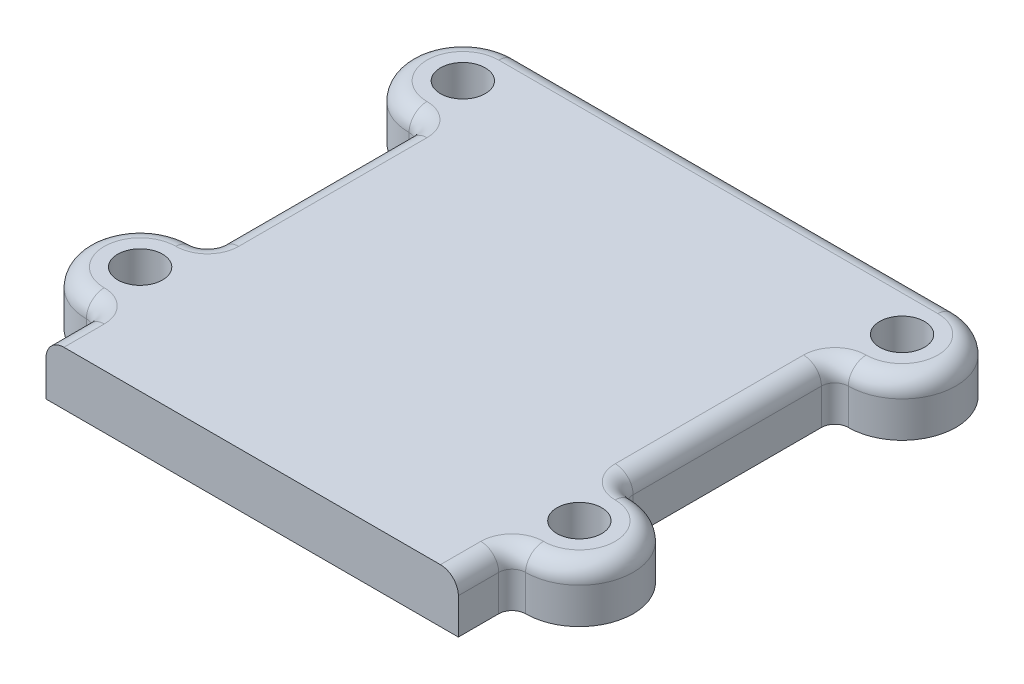
ISO-10303-21;
HEADER;
FILE_DESCRIPTION(('STEP AP214'),'2;1');
FILE_NAME('part.step','',(''),(''),'','','');
FILE_SCHEMA(('AUTOMOTIVE_DESIGN { 1 0 10303 214 1 1 1 1 }'));
ENDSEC;
DATA;
#1=APPLICATION_CONTEXT('core data for automotive mechanical design processes');
#2=APPLICATION_PROTOCOL_DEFINITION('international standard','automotive_design',2000,#1);
#3=PRODUCT_CONTEXT('',#1,'mechanical');
#4=PRODUCT('Part','Part','',(#3));
#5=PRODUCT_RELATED_PRODUCT_CATEGORY('part','',(#4));
#6=PRODUCT_DEFINITION_FORMATION('','',#4);
#7=PRODUCT_DEFINITION_CONTEXT('part definition',#1,'design');
#8=PRODUCT_DEFINITION('design','',#6,#7);
#9=PRODUCT_DEFINITION_SHAPE('','',#8);
#10=(LENGTH_UNIT() NAMED_UNIT(*) SI_UNIT(.MILLI.,.METRE.));
#11=(NAMED_UNIT(*) PLANE_ANGLE_UNIT() SI_UNIT($,.RADIAN.));
#12=(NAMED_UNIT(*) SI_UNIT($,.STERADIAN.) SOLID_ANGLE_UNIT());
#13=UNCERTAINTY_MEASURE_WITH_UNIT(LENGTH_MEASURE(1.E-05),#10,'distance_accuracy_value','');
#14=(GEOMETRIC_REPRESENTATION_CONTEXT(3) GLOBAL_UNCERTAINTY_ASSIGNED_CONTEXT((#13)) GLOBAL_UNIT_ASSIGNED_CONTEXT((#10,
#11,#12)) REPRESENTATION_CONTEXT('',''));
#15=CARTESIAN_POINT('',(0.,0.,0.));
#16=DIRECTION('',(0.,0.,1.));
#17=DIRECTION('',(1.,0.,0.));
#18=AXIS2_PLACEMENT_3D('',#15,#16,#17);
#19=CARTESIAN_POINT('',(12.25,3.,21.));
#20=DIRECTION('',(0.,-1.,0.));
#21=DIRECTION('',(0.,0.,-1.));
#22=AXIS2_PLACEMENT_3D('',#19,#20,#21);
#23=PLANE('',#22);
#24=DIRECTION('',(1.,0.,0.));
#25=VECTOR('',#24,1.);
#26=CARTESIAN_POINT('',(-11.5,3.,27.0000000000913));
#27=LINE('',#26,#25);
#28=CARTESIAN_POINT('',(-10.5,3.,27.0000000000913));
#29=VERTEX_POINT('',#28);
#30=CARTESIAN_POINT('',(10.5,3.,27.0000000000913));
#31=VERTEX_POINT('',#30);
#32=EDGE_CURVE('E234',#29,#31,#27,.T.);
#33=ORIENTED_EDGE('',*,*,#32,.T.);
#34=DIRECTION('',(0.,0.,-1.));
#35=VECTOR('',#34,1.);
#36=CARTESIAN_POINT('',(10.5,3.,21.));
#37=LINE('',#36,#35);
#38=CARTESIAN_POINT('',(10.5,3.,24.75));
#39=VERTEX_POINT('',#38);
#40=EDGE_CURVE('E329',#31,#39,#37,.T.);
#41=ORIENTED_EDGE('',*,*,#40,.T.);
#42=CARTESIAN_POINT('',(12.25,3.,24.75));
#43=DIRECTION('',(0.,-1.,0.));
#44=DIRECTION('',(0.,0.,-1.));
#45=AXIS2_PLACEMENT_3D('',#42,#43,#44);
#46=CIRCLE('',#45,1.75);
#47=CARTESIAN_POINT('',(12.25,3.,23.));
#48=VERTEX_POINT('',#47);
#49=EDGE_CURVE('E327',#39,#48,#46,.T.);
#50=ORIENTED_EDGE('',*,*,#49,.T.);
#51=CARTESIAN_POINT('',(12.25,3.,21.));
#52=DIRECTION('',(0.,-1.,0.));
#53=DIRECTION('',(0.,0.,-1.));
#54=AXIS2_PLACEMENT_3D('',#51,#52,#53);
#55=CIRCLE('',#54,2.);
#56=CARTESIAN_POINT('',(12.25,3.,19.));
#57=VERTEX_POINT('',#56);
#58=EDGE_CURVE('E325',#48,#57,#55,.F.);
#59=ORIENTED_EDGE('',*,*,#58,.T.);
#60=CARTESIAN_POINT('',(12.25,3.,17.25));
#61=DIRECTION('',(0.,-1.,0.));
#62=DIRECTION('',(0.,0.,-1.));
#63=AXIS2_PLACEMENT_3D('',#60,#61,#62);
#64=CIRCLE('',#63,1.75);
#65=CARTESIAN_POINT('',(10.5,3.,17.25));
#66=VERTEX_POINT('',#65);
#67=EDGE_CURVE('E323',#57,#66,#64,.T.);
#68=ORIENTED_EDGE('',*,*,#67,.T.);
#69=DIRECTION('',(0.,0.,-1.));
#70=VECTOR('',#69,1.);
#71=CARTESIAN_POINT('',(10.5,3.,21.));
#72=LINE('',#71,#70);
#73=CARTESIAN_POINT('',(10.5,3.,6.74999999999999));
#74=VERTEX_POINT('',#73);
#75=EDGE_CURVE('E301',#66,#74,#72,.T.);
#76=ORIENTED_EDGE('',*,*,#75,.T.);
#77=CARTESIAN_POINT('',(12.25,3.,6.74999999999999));
#78=DIRECTION('',(0.,-1.,0.));
#79=DIRECTION('',(0.,0.,-1.));
#80=AXIS2_PLACEMENT_3D('',#77,#78,#79);
#81=CIRCLE('',#80,1.75);
#82=CARTESIAN_POINT('',(12.25,3.,4.99999999999999));
#83=VERTEX_POINT('',#82);
#84=EDGE_CURVE('E303',#74,#83,#81,.T.);
#85=ORIENTED_EDGE('',*,*,#84,.T.);
#86=CARTESIAN_POINT('',(12.25,3.,2.99999999999999));
#87=DIRECTION('',(0.,-1.,0.));
#88=DIRECTION('',(0.,0.,-1.));
#89=AXIS2_PLACEMENT_3D('',#86,#87,#88);
#90=CIRCLE('',#89,2.);
#91=CARTESIAN_POINT('',(12.25,3.,0.999999999999996));
#92=VERTEX_POINT('',#91);
#93=EDGE_CURVE('E305',#83,#92,#90,.F.);
#94=ORIENTED_EDGE('',*,*,#93,.T.);
#95=DIRECTION('',(-1.,0.,0.));
#96=VECTOR('',#95,1.);
#97=CARTESIAN_POINT('',(12.25,3.,0.999999999999997));
#98=LINE('',#97,#96);
#99=CARTESIAN_POINT('',(-12.25,3.,1.));
#100=VERTEX_POINT('',#99);
#101=EDGE_CURVE('E307',#92,#100,#98,.T.);
#102=ORIENTED_EDGE('',*,*,#101,.T.);
#103=CARTESIAN_POINT('',(-12.25,3.,3.));
#104=DIRECTION('',(0.,-1.,0.));
#105=DIRECTION('',(0.,0.,-1.));
#106=AXIS2_PLACEMENT_3D('',#103,#104,#105);
#107=CIRCLE('',#106,2.);
#108=CARTESIAN_POINT('',(-12.25,3.,4.99999999999999));
#109=VERTEX_POINT('',#108);
#110=EDGE_CURVE('E309',#100,#109,#107,.F.);
#111=ORIENTED_EDGE('',*,*,#110,.T.);
#112=CARTESIAN_POINT('',(-12.25,3.,6.74999999999999));
#113=DIRECTION('',(0.,-1.,0.));
#114=DIRECTION('',(0.,0.,-1.));
#115=AXIS2_PLACEMENT_3D('',#112,#113,#114);
#116=CIRCLE('',#115,1.75);
#117=CARTESIAN_POINT('',(-10.5,3.,6.74999999999999));
#118=VERTEX_POINT('',#117);
#119=EDGE_CURVE('E311',#109,#118,#116,.T.);
#120=ORIENTED_EDGE('',*,*,#119,.T.);
#121=DIRECTION('',(0.,0.,1.));
#122=VECTOR('',#121,1.);
#123=CARTESIAN_POINT('',(-10.5,3.,21.));
#124=LINE('',#123,#122);
#125=CARTESIAN_POINT('',(-10.5,3.,17.25));
#126=VERTEX_POINT('',#125);
#127=EDGE_CURVE('E313',#118,#126,#124,.T.);
#128=ORIENTED_EDGE('',*,*,#127,.T.);
#129=CARTESIAN_POINT('',(-12.25,3.,17.25));
#130=DIRECTION('',(0.,-1.,0.));
#131=DIRECTION('',(0.,0.,-1.));
#132=AXIS2_PLACEMENT_3D('',#129,#130,#131);
#133=CIRCLE('',#132,1.75);
#134=CARTESIAN_POINT('',(-12.25,3.,19.));
#135=VERTEX_POINT('',#134);
#136=EDGE_CURVE('E315',#126,#135,#133,.T.);
#137=ORIENTED_EDGE('',*,*,#136,.T.);
#138=CARTESIAN_POINT('',(-12.25,3.,21.));
#139=DIRECTION('',(0.,-1.,0.));
#140=DIRECTION('',(0.,0.,-1.));
#141=AXIS2_PLACEMENT_3D('',#138,#139,#140);
#142=CIRCLE('',#141,2.);
#143=CARTESIAN_POINT('',(-12.25,3.,23.));
#144=VERTEX_POINT('',#143);
#145=EDGE_CURVE('E317',#135,#144,#142,.F.);
#146=ORIENTED_EDGE('',*,*,#145,.T.);
#147=CARTESIAN_POINT('',(-12.25,3.,24.75));
#148=DIRECTION('',(0.,-1.,0.));
#149=DIRECTION('',(0.,0.,-1.));
#150=AXIS2_PLACEMENT_3D('',#147,#148,#149);
#151=CIRCLE('',#150,1.75);
#152=CARTESIAN_POINT('',(-10.5,3.,24.75));
#153=VERTEX_POINT('',#152);
#154=EDGE_CURVE('E319',#144,#153,#151,.T.);
#155=ORIENTED_EDGE('',*,*,#154,.T.);
#156=DIRECTION('',(0.,0.,1.));
#157=VECTOR('',#156,1.);
#158=CARTESIAN_POINT('',(-10.5,3.,21.));
#159=LINE('',#158,#157);
#160=EDGE_CURVE('E321',#153,#29,#159,.T.);
#161=ORIENTED_EDGE('',*,*,#160,.T.);
#162=EDGE_LOOP('',(#33,#41,#50,#59,#68,#76,#85,#94,#102,#111,#120,#128,#137,#146,#155,#161));
#163=FACE_BOUND('',#162,.T.);
#164=CARTESIAN_POINT('',(12.25,3.,2.99999999999999));
#165=DIRECTION('',(0.,1.,0.));
#166=DIRECTION('',(0.,0.,1.));
#167=AXIS2_PLACEMENT_3D('',#164,#165,#166);
#168=CIRCLE('',#167,1.25);
#169=CARTESIAN_POINT('',(12.25,3.,4.25));
#170=VERTEX_POINT('',#169);
#171=EDGE_CURVE('E228',#170,#170,#168,.T.);
#172=ORIENTED_EDGE('',*,*,#171,.F.);
#173=EDGE_LOOP('',(#172));
#174=FACE_BOUND('',#173,.T.);
#175=CARTESIAN_POINT('',(12.25,3.,21.));
#176=DIRECTION('',(0.,1.,0.));
#177=DIRECTION('',(0.,0.,1.));
#178=AXIS2_PLACEMENT_3D('',#175,#176,#177);
#179=CIRCLE('',#178,1.25);
#180=CARTESIAN_POINT('',(12.25,3.,22.25));
#181=VERTEX_POINT('',#180);
#182=EDGE_CURVE('E422',#181,#181,#179,.T.);
#183=ORIENTED_EDGE('',*,*,#182,.F.);
#184=EDGE_LOOP('',(#183));
#185=FACE_BOUND('',#184,.T.);
#186=CARTESIAN_POINT('',(-12.25,3.,21.));
#187=DIRECTION('',(0.,1.,0.));
#188=DIRECTION('',(0.,0.,-1.));
#189=AXIS2_PLACEMENT_3D('',#186,#187,#188);
#190=CIRCLE('',#189,1.25);
#191=CARTESIAN_POINT('',(-12.25,3.,19.75));
#192=VERTEX_POINT('',#191);
#193=EDGE_CURVE('E416',#192,#192,#190,.T.);
#194=ORIENTED_EDGE('',*,*,#193,.F.);
#195=EDGE_LOOP('',(#194));
#196=FACE_BOUND('',#195,.T.);
#197=CARTESIAN_POINT('',(-12.25,3.,3.));
#198=DIRECTION('',(0.,1.,0.));
#199=DIRECTION('',(0.,0.,-1.));
#200=AXIS2_PLACEMENT_3D('',#197,#198,#199);
#201=CIRCLE('',#200,1.25);
#202=CARTESIAN_POINT('',(-12.25,3.,1.74999999999999));
#203=VERTEX_POINT('',#202);
#204=EDGE_CURVE('E408',#203,#203,#201,.T.);
#205=ORIENTED_EDGE('',*,*,#204,.F.);
#206=EDGE_LOOP('',(#205));
#207=FACE_BOUND('',#206,.T.);
#208=ADVANCED_FACE('F36',(#163,#174,#185,#196,#207),#23,.F.);
#209=CARTESIAN_POINT('',(12.25,0.,21.));
#210=DIRECTION('',(0.,-1.,0.));
#211=DIRECTION('',(0.,0.,-1.));
#212=AXIS2_PLACEMENT_3D('',#209,#210,#211);
#213=PLANE('',#212);
#214=CARTESIAN_POINT('',(-12.25,0.,21.));
#215=DIRECTION('',(0.,1.,0.));
#216=DIRECTION('',(0.,0.,-1.));
#217=AXIS2_PLACEMENT_3D('',#214,#215,#216);
#218=CIRCLE('',#217,1.25);
#219=CARTESIAN_POINT('',(-12.25,0.,19.75));
#220=VERTEX_POINT('',#219);
#221=EDGE_CURVE('E413',#220,#220,#218,.T.);
#222=ORIENTED_EDGE('',*,*,#221,.T.);
#223=EDGE_LOOP('',(#222));
#224=FACE_BOUND('',#223,.T.);
#225=CARTESIAN_POINT('',(12.25,0.,2.99999999999999));
#226=DIRECTION('',(0.,1.,0.));
#227=DIRECTION('',(0.,0.,1.));
#228=AXIS2_PLACEMENT_3D('',#225,#226,#227);
#229=CIRCLE('',#228,1.25);
#230=CARTESIAN_POINT('',(12.25,0.,4.25));
#231=VERTEX_POINT('',#230);
#232=EDGE_CURVE('E231',#231,#231,#229,.T.);
#233=ORIENTED_EDGE('',*,*,#232,.T.);
#234=EDGE_LOOP('',(#233));
#235=FACE_BOUND('',#234,.T.);
#236=DIRECTION('',(1.,0.,0.));
#237=VECTOR('',#236,1.);
#238=CARTESIAN_POINT('',(-11.5,0.,27.0000000000913));
#239=LINE('',#238,#237);
#240=CARTESIAN_POINT('',(-11.5,0.,27.0000000000913));
#241=VERTEX_POINT('',#240);
#242=CARTESIAN_POINT('',(11.5,0.,27.0000000000913));
#243=VERTEX_POINT('',#242);
#244=EDGE_CURVE('E218',#241,#243,#239,.T.);
#245=ORIENTED_EDGE('',*,*,#244,.F.);
#246=DIRECTION('',(0.,0.,1.));
#247=VECTOR('',#246,1.);
#248=CARTESIAN_POINT('',(-11.5,0.,24.));
#249=LINE('',#248,#247);
#250=CARTESIAN_POINT('',(-11.5,0.,24.75));
#251=VERTEX_POINT('',#250);
#252=EDGE_CURVE('E257',#251,#241,#249,.T.);
#253=ORIENTED_EDGE('',*,*,#252,.F.);
#254=CARTESIAN_POINT('',(-12.25,0.,24.75));
#255=DIRECTION('',(0.,-1.,0.));
#256=DIRECTION('',(0.,0.,-1.));
#257=AXIS2_PLACEMENT_3D('',#254,#255,#256);
#258=CIRCLE('',#257,0.75);
#259=CARTESIAN_POINT('',(-12.25,0.,24.));
#260=VERTEX_POINT('',#259);
#261=EDGE_CURVE('E289',#251,#260,#258,.F.);
#262=ORIENTED_EDGE('',*,*,#261,.T.);
#263=CARTESIAN_POINT('',(-12.25,0.,21.));
#264=DIRECTION('',(0.,1.,0.));
#265=DIRECTION('',(0.,0.,1.));
#266=AXIS2_PLACEMENT_3D('',#263,#264,#265);
#267=CIRCLE('',#266,3.);
#268=CARTESIAN_POINT('',(-12.25,0.,18.));
#269=VERTEX_POINT('',#268);
#270=EDGE_CURVE('E254',#269,#260,#267,.T.);
#271=ORIENTED_EDGE('',*,*,#270,.F.);
#272=CARTESIAN_POINT('',(-12.25,0.,17.25));
#273=DIRECTION('',(0.,-1.,0.));
#274=DIRECTION('',(0.,0.,-1.));
#275=AXIS2_PLACEMENT_3D('',#272,#273,#274);
#276=CIRCLE('',#275,0.75);
#277=CARTESIAN_POINT('',(-11.5,0.,17.25));
#278=VERTEX_POINT('',#277);
#279=EDGE_CURVE('E287',#269,#278,#276,.F.);
#280=ORIENTED_EDGE('',*,*,#279,.T.);
#281=DIRECTION('',(0.,0.,1.));
#282=VECTOR('',#281,1.);
#283=CARTESIAN_POINT('',(-11.5,0.,5.99999999999999));
#284=LINE('',#283,#282);
#285=CARTESIAN_POINT('',(-11.5,0.,6.74999999999999));
#286=VERTEX_POINT('',#285);
#287=EDGE_CURVE('E251',#286,#278,#284,.T.);
#288=ORIENTED_EDGE('',*,*,#287,.F.);
#289=CARTESIAN_POINT('',(-12.25,0.,6.74999999999999));
#290=DIRECTION('',(0.,-1.,0.));
#291=DIRECTION('',(0.,0.,-1.));
#292=AXIS2_PLACEMENT_3D('',#289,#290,#291);
#293=CIRCLE('',#292,0.75);
#294=CARTESIAN_POINT('',(-12.25,0.,5.99999999999999));
#295=VERTEX_POINT('',#294);
#296=EDGE_CURVE('E292',#286,#295,#293,.F.);
#297=ORIENTED_EDGE('',*,*,#296,.T.);
#298=CARTESIAN_POINT('',(-12.25,0.,3.));
#299=DIRECTION('',(0.,1.,0.));
#300=DIRECTION('',(0.,0.,1.));
#301=AXIS2_PLACEMENT_3D('',#298,#299,#300);
#302=CIRCLE('',#301,3.);
#303=CARTESIAN_POINT('',(-12.25,0.,0.));
#304=VERTEX_POINT('',#303);
#305=EDGE_CURVE('E248',#304,#295,#302,.T.);
#306=ORIENTED_EDGE('',*,*,#305,.F.);
#307=DIRECTION('',(-1.,0.,0.));
#308=VECTOR('',#307,1.);
#309=CARTESIAN_POINT('',(-12.25,0.,0.));
#310=LINE('',#309,#308);
#311=CARTESIAN_POINT('',(12.25,0.,0.));
#312=VERTEX_POINT('',#311);
#313=EDGE_CURVE('E245',#312,#304,#310,.T.);
#314=ORIENTED_EDGE('',*,*,#313,.F.);
#315=CARTESIAN_POINT('',(12.25,0.,2.99999999999999));
#316=DIRECTION('',(0.,1.,0.));
#317=DIRECTION('',(0.,0.,-1.));
#318=AXIS2_PLACEMENT_3D('',#315,#316,#317);
#319=CIRCLE('',#318,3.);
#320=CARTESIAN_POINT('',(12.25,0.,5.99999999999999));
#321=VERTEX_POINT('',#320);
#322=EDGE_CURVE('E242',#321,#312,#319,.T.);
#323=ORIENTED_EDGE('',*,*,#322,.F.);
#324=CARTESIAN_POINT('',(12.25,0.,6.74999999999999));
#325=DIRECTION('',(0.,-1.,0.));
#326=DIRECTION('',(0.,0.,-1.));
#327=AXIS2_PLACEMENT_3D('',#324,#325,#326);
#328=CIRCLE('',#327,0.75);
#329=CARTESIAN_POINT('',(11.5,0.,6.74999999999999));
#330=VERTEX_POINT('',#329);
#331=EDGE_CURVE('E295',#321,#330,#328,.F.);
#332=ORIENTED_EDGE('',*,*,#331,.T.);
#333=DIRECTION('',(0.,0.,-1.));
#334=VECTOR('',#333,1.);
#335=CARTESIAN_POINT('',(11.5,0.,5.99999999999999));
#336=LINE('',#335,#334);
#337=CARTESIAN_POINT('',(11.5,0.,17.25));
#338=VERTEX_POINT('',#337);
#339=EDGE_CURVE('E239',#338,#330,#336,.T.);
#340=ORIENTED_EDGE('',*,*,#339,.F.);
#341=CARTESIAN_POINT('',(12.25,0.,17.25));
#342=DIRECTION('',(0.,-1.,0.));
#343=DIRECTION('',(0.,0.,-1.));
#344=AXIS2_PLACEMENT_3D('',#341,#342,#343);
#345=CIRCLE('',#344,0.75);
#346=CARTESIAN_POINT('',(12.25,0.,18.));
#347=VERTEX_POINT('',#346);
#348=EDGE_CURVE('E298',#338,#347,#345,.F.);
#349=ORIENTED_EDGE('',*,*,#348,.T.);
#350=CARTESIAN_POINT('',(12.25,0.,21.));
#351=DIRECTION('',(0.,1.,0.));
#352=DIRECTION('',(0.,0.,-1.));
#353=AXIS2_PLACEMENT_3D('',#350,#351,#352);
#354=CIRCLE('',#353,3.);
#355=CARTESIAN_POINT('',(12.25,0.,24.));
#356=VERTEX_POINT('',#355);
#357=EDGE_CURVE('E222',#356,#347,#354,.T.);
#358=ORIENTED_EDGE('',*,*,#357,.F.);
#359=CARTESIAN_POINT('',(12.25,0.,24.75));
#360=DIRECTION('',(0.,-1.,0.));
#361=DIRECTION('',(0.,0.,-1.));
#362=AXIS2_PLACEMENT_3D('',#359,#360,#361);
#363=CIRCLE('',#362,0.75);
#364=CARTESIAN_POINT('',(11.5,0.,24.75));
#365=VERTEX_POINT('',#364);
#366=EDGE_CURVE('E221',#356,#365,#363,.F.);
#367=ORIENTED_EDGE('',*,*,#366,.T.);
#368=DIRECTION('',(0.,0.,-1.));
#369=VECTOR('',#368,1.);
#370=CARTESIAN_POINT('',(11.5,0.,24.));
#371=LINE('',#370,#369);
#372=EDGE_CURVE('E203',#243,#365,#371,.T.);
#373=ORIENTED_EDGE('',*,*,#372,.F.);
#374=EDGE_LOOP('',(#245,#253,#262,#271,#280,#288,#297,#306,#314,#323,#332,#340,#349,#358,#367,#373));
#375=FACE_BOUND('',#374,.T.);
#376=CARTESIAN_POINT('',(12.25,0.,21.));
#377=DIRECTION('',(0.,1.,0.));
#378=DIRECTION('',(0.,0.,1.));
#379=AXIS2_PLACEMENT_3D('',#376,#377,#378);
#380=CIRCLE('',#379,1.25);
#381=CARTESIAN_POINT('',(12.25,0.,22.25));
#382=VERTEX_POINT('',#381);
#383=EDGE_CURVE('E419',#382,#382,#380,.T.);
#384=ORIENTED_EDGE('',*,*,#383,.T.);
#385=EDGE_LOOP('',(#384));
#386=FACE_BOUND('',#385,.T.);
#387=CARTESIAN_POINT('',(-12.25,0.,3.));
#388=DIRECTION('',(0.,1.,0.));
#389=DIRECTION('',(0.,0.,-1.));
#390=AXIS2_PLACEMENT_3D('',#387,#388,#389);
#391=CIRCLE('',#390,1.25);
#392=CARTESIAN_POINT('',(-12.25,0.,1.74999999999999));
#393=VERTEX_POINT('',#392);
#394=EDGE_CURVE('E402',#393,#393,#391,.T.);
#395=ORIENTED_EDGE('',*,*,#394,.T.);
#396=EDGE_LOOP('',(#395));
#397=FACE_BOUND('',#396,.T.);
#398=ADVANCED_FACE('F215',(#224,#235,#375,#386,#397),#213,.T.);
#399=CARTESIAN_POINT('',(-11.5,3.,27.0000000000913));
#400=DIRECTION('',(0.,0.,-1.));
#401=DIRECTION('',(-1.,0.,0.));
#402=AXIS2_PLACEMENT_3D('',#399,#400,#401);
#403=PLANE('',#402);
#404=DIRECTION('',(0.,-1.,0.));
#405=VECTOR('',#404,1.);
#406=CARTESIAN_POINT('',(11.5,3.,27.0000000000913));
#407=LINE('',#406,#405);
#408=CARTESIAN_POINT('',(11.5,2.,27.0000000000913));
#409=VERTEX_POINT('',#408);
#410=EDGE_CURVE('E199',#409,#243,#407,.T.);
#411=ORIENTED_EDGE('',*,*,#410,.F.);
#412=CARTESIAN_POINT('',(10.5,2.,27.0000000000913));
#413=DIRECTION('',(0.,0.,-1.));
#414=DIRECTION('',(-1.,0.,0.));
#415=AXIS2_PLACEMENT_3D('',#412,#413,#414);
#416=CIRCLE('',#415,1.);
#417=EDGE_CURVE('E335',#409,#31,#416,.F.);
#418=ORIENTED_EDGE('',*,*,#417,.T.);
#419=ORIENTED_EDGE('',*,*,#32,.F.);
#420=CARTESIAN_POINT('',(-10.5,2.,27.0000000000913));
#421=DIRECTION('',(0.,0.,-1.));
#422=DIRECTION('',(-1.,0.,0.));
#423=AXIS2_PLACEMENT_3D('',#420,#421,#422);
#424=CIRCLE('',#423,1.);
#425=CARTESIAN_POINT('',(-11.5,2.,27.0000000000913));
#426=VERTEX_POINT('',#425);
#427=EDGE_CURVE('E333',#29,#426,#424,.F.);
#428=ORIENTED_EDGE('',*,*,#427,.T.);
#429=DIRECTION('',(0.,-1.,0.));
#430=VECTOR('',#429,1.);
#431=CARTESIAN_POINT('',(-11.5,3.,27.0000000000913));
#432=LINE('',#431,#430);
#433=EDGE_CURVE('E226',#426,#241,#432,.T.);
#434=ORIENTED_EDGE('',*,*,#433,.T.);
#435=ORIENTED_EDGE('',*,*,#244,.T.);
#436=EDGE_LOOP('',(#411,#418,#419,#428,#434,#435));
#437=FACE_BOUND('',#436,.T.);
#438=ADVANCED_FACE('F224',(#437),#403,.F.);
#439=CARTESIAN_POINT('',(11.5,3.,24.));
#440=DIRECTION('',(-1.,0.,0.));
#441=DIRECTION('',(0.,0.,1.));
#442=AXIS2_PLACEMENT_3D('',#439,#440,#441);
#443=PLANE('',#442);
#444=DIRECTION('',(0.,-1.,0.));
#445=VECTOR('',#444,1.);
#446=CARTESIAN_POINT('',(11.5,3.,24.75));
#447=LINE('',#446,#445);
#448=CARTESIAN_POINT('',(11.5,2.,24.75));
#449=VERTEX_POINT('',#448);
#450=EDGE_CURVE('E285',#365,#449,#447,.F.);
#451=ORIENTED_EDGE('',*,*,#450,.T.);
#452=DIRECTION('',(0.,0.,-1.));
#453=VECTOR('',#452,1.);
#454=CARTESIAN_POINT('',(11.5,2.,24.));
#455=LINE('',#454,#453);
#456=EDGE_CURVE('E206',#449,#409,#455,.F.);
#457=ORIENTED_EDGE('',*,*,#456,.T.);
#458=ORIENTED_EDGE('',*,*,#410,.T.);
#459=ORIENTED_EDGE('',*,*,#372,.T.);
#460=EDGE_LOOP('',(#451,#457,#458,#459));
#461=FACE_BOUND('',#460,.T.);
#462=ADVANCED_FACE('F202',(#461),#443,.F.);
#463=CARTESIAN_POINT('',(12.25,3.,21.));
#464=DIRECTION('',(0.,-1.,0.));
#465=DIRECTION('',(0.,0.,-1.));
#466=AXIS2_PLACEMENT_3D('',#463,#464,#465);
#467=CYLINDRICAL_SURFACE('',#466,3.);
#468=DIRECTION('',(0.,-1.,0.));
#469=VECTOR('',#468,1.);
#470=CARTESIAN_POINT('',(12.25,3.,18.));
#471=LINE('',#470,#469);
#472=CARTESIAN_POINT('',(12.25,2.,18.));
#473=VERTEX_POINT('',#472);
#474=EDGE_CURVE('E272',#473,#347,#471,.T.);
#475=ORIENTED_EDGE('',*,*,#474,.F.);
#476=CARTESIAN_POINT('',(12.25,2.,21.));
#477=DIRECTION('',(0.,-1.,0.));
#478=DIRECTION('',(0.,0.,-1.));
#479=AXIS2_PLACEMENT_3D('',#476,#477,#478);
#480=CIRCLE('',#479,3.);
#481=CARTESIAN_POINT('',(12.25,2.,24.));
#482=VERTEX_POINT('',#481);
#483=EDGE_CURVE('E339',#473,#482,#480,.T.);
#484=ORIENTED_EDGE('',*,*,#483,.T.);
#485=DIRECTION('',(0.,-1.,0.));
#486=VECTOR('',#485,1.);
#487=CARTESIAN_POINT('',(12.25,3.,24.));
#488=LINE('',#487,#486);
#489=EDGE_CURVE('E211',#482,#356,#488,.T.);
#490=ORIENTED_EDGE('',*,*,#489,.T.);
#491=ORIENTED_EDGE('',*,*,#357,.T.);
#492=EDGE_LOOP('',(#475,#484,#490,#491));
#493=FACE_BOUND('',#492,.T.);
#494=ADVANCED_FACE('F478',(#493),#467,.T.);
#495=CARTESIAN_POINT('',(11.5,3.,5.99999999999999));
#496=DIRECTION('',(-1.,0.,0.));
#497=DIRECTION('',(0.,0.,1.));
#498=AXIS2_PLACEMENT_3D('',#495,#496,#497);
#499=PLANE('',#498);
#500=DIRECTION('',(0.,-1.,0.));
#501=VECTOR('',#500,1.);
#502=CARTESIAN_POINT('',(11.5,3.,6.74999999999999));
#503=LINE('',#502,#501);
#504=CARTESIAN_POINT('',(11.5,2.,6.74999999999999));
#505=VERTEX_POINT('',#504);
#506=EDGE_CURVE('E283',#330,#505,#503,.F.);
#507=ORIENTED_EDGE('',*,*,#506,.T.);
#508=DIRECTION('',(0.,0.,-1.));
#509=VECTOR('',#508,1.);
#510=CARTESIAN_POINT('',(11.5,2.,5.99999999999999));
#511=LINE('',#510,#509);
#512=CARTESIAN_POINT('',(11.5,2.,17.25));
#513=VERTEX_POINT('',#512);
#514=EDGE_CURVE('E11',#505,#513,#511,.F.);
#515=ORIENTED_EDGE('',*,*,#514,.T.);
#516=DIRECTION('',(0.,-1.,0.));
#517=VECTOR('',#516,1.);
#518=CARTESIAN_POINT('',(11.5,0.,17.25));
#519=LINE('',#518,#517);
#520=EDGE_CURVE('E281',#513,#338,#519,.T.);
#521=ORIENTED_EDGE('',*,*,#520,.T.);
#522=ORIENTED_EDGE('',*,*,#339,.T.);
#523=EDGE_LOOP('',(#507,#515,#521,#522));
#524=FACE_BOUND('',#523,.T.);
#525=ADVANCED_FACE('F475',(#524),#499,.F.);
#526=CARTESIAN_POINT('',(12.25,3.,2.99999999999999));
#527=DIRECTION('',(0.,-1.,0.));
#528=DIRECTION('',(0.,0.,-1.));
#529=AXIS2_PLACEMENT_3D('',#526,#527,#528);
#530=CYLINDRICAL_SURFACE('',#529,3.);
#531=DIRECTION('',(0.,-1.,0.));
#532=VECTOR('',#531,1.);
#533=CARTESIAN_POINT('',(12.25,3.,0.));
#534=LINE('',#533,#532);
#535=CARTESIAN_POINT('',(12.25,2.,0.));
#536=VERTEX_POINT('',#535);
#537=EDGE_CURVE('E268',#536,#312,#534,.T.);
#538=ORIENTED_EDGE('',*,*,#537,.F.);
#539=CARTESIAN_POINT('',(12.25,2.,2.99999999999999));
#540=DIRECTION('',(0.,-1.,0.));
#541=DIRECTION('',(0.,0.,-1.));
#542=AXIS2_PLACEMENT_3D('',#539,#540,#541);
#543=CIRCLE('',#542,3.);
#544=CARTESIAN_POINT('',(12.25,2.,5.99999999999999));
#545=VERTEX_POINT('',#544);
#546=EDGE_CURVE('E60',#536,#545,#543,.T.);
#547=ORIENTED_EDGE('',*,*,#546,.T.);
#548=DIRECTION('',(0.,-1.,0.));
#549=VECTOR('',#548,1.);
#550=CARTESIAN_POINT('',(12.25,3.,5.99999999999999));
#551=LINE('',#550,#549);
#552=EDGE_CURVE('E270',#545,#321,#551,.T.);
#553=ORIENTED_EDGE('',*,*,#552,.T.);
#554=ORIENTED_EDGE('',*,*,#322,.T.);
#555=EDGE_LOOP('',(#538,#547,#553,#554));
#556=FACE_BOUND('',#555,.T.);
#557=ADVANCED_FACE('F471',(#556),#530,.T.);
#558=CARTESIAN_POINT('',(-12.25,3.,0.));
#559=DIRECTION('',(0.,0.,1.));
#560=DIRECTION('',(1.,0.,0.));
#561=AXIS2_PLACEMENT_3D('',#558,#559,#560);
#562=PLANE('',#561);
#563=DIRECTION('',(0.,-1.,0.));
#564=VECTOR('',#563,1.);
#565=CARTESIAN_POINT('',(-12.25,3.,0.));
#566=LINE('',#565,#564);
#567=CARTESIAN_POINT('',(-12.25,2.,0.));
#568=VERTEX_POINT('',#567);
#569=EDGE_CURVE('E266',#568,#304,#566,.T.);
#570=ORIENTED_EDGE('',*,*,#569,.F.);
#571=DIRECTION('',(-1.,0.,0.));
#572=VECTOR('',#571,1.);
#573=CARTESIAN_POINT('',(-12.25,2.,0.));
#574=LINE('',#573,#572);
#575=EDGE_CURVE('E357',#568,#536,#574,.F.);
#576=ORIENTED_EDGE('',*,*,#575,.T.);
#577=ORIENTED_EDGE('',*,*,#537,.T.);
#578=ORIENTED_EDGE('',*,*,#313,.T.);
#579=EDGE_LOOP('',(#570,#576,#577,#578));
#580=FACE_BOUND('',#579,.T.);
#581=ADVANCED_FACE('F467',(#580),#562,.F.);
#582=CARTESIAN_POINT('',(-12.25,3.,3.));
#583=DIRECTION('',(0.,-1.,0.));
#584=DIRECTION('',(0.,0.,-1.));
#585=AXIS2_PLACEMENT_3D('',#582,#583,#584);
#586=CYLINDRICAL_SURFACE('',#585,3.);
#587=DIRECTION('',(0.,-1.,0.));
#588=VECTOR('',#587,1.);
#589=CARTESIAN_POINT('',(-12.25,3.,5.99999999999999));
#590=LINE('',#589,#588);
#591=CARTESIAN_POINT('',(-12.25,2.,5.99999999999999));
#592=VERTEX_POINT('',#591);
#593=EDGE_CURVE('E264',#592,#295,#590,.T.);
#594=ORIENTED_EDGE('',*,*,#593,.F.);
#595=CARTESIAN_POINT('',(-12.25,2.,3.));
#596=DIRECTION('',(0.,-1.,0.));
#597=DIRECTION('',(0.,0.,-1.));
#598=AXIS2_PLACEMENT_3D('',#595,#596,#597);
#599=CIRCLE('',#598,3.);
#600=EDGE_CURVE('E355',#592,#568,#599,.T.);
#601=ORIENTED_EDGE('',*,*,#600,.T.);
#602=ORIENTED_EDGE('',*,*,#569,.T.);
#603=ORIENTED_EDGE('',*,*,#305,.T.);
#604=EDGE_LOOP('',(#594,#601,#602,#603));
#605=FACE_BOUND('',#604,.T.);
#606=ADVANCED_FACE('F463',(#605),#586,.T.);
#607=CARTESIAN_POINT('',(-11.5,3.,5.99999999999999));
#608=DIRECTION('',(1.,0.,0.));
#609=DIRECTION('',(0.,0.,-1.));
#610=AXIS2_PLACEMENT_3D('',#607,#608,#609);
#611=PLANE('',#610);
#612=DIRECTION('',(0.,-1.,0.));
#613=VECTOR('',#612,1.);
#614=CARTESIAN_POINT('',(-11.5,3.,17.25));
#615=LINE('',#614,#613);
#616=CARTESIAN_POINT('',(-11.5,2.,17.25));
#617=VERTEX_POINT('',#616);
#618=EDGE_CURVE('E276',#278,#617,#615,.F.);
#619=ORIENTED_EDGE('',*,*,#618,.T.);
#620=DIRECTION('',(0.,0.,1.));
#621=VECTOR('',#620,1.);
#622=CARTESIAN_POINT('',(-11.5,2.,5.99999999999999));
#623=LINE('',#622,#621);
#624=CARTESIAN_POINT('',(-11.5,2.,6.74999999999999));
#625=VERTEX_POINT('',#624);
#626=EDGE_CURVE('E351',#617,#625,#623,.F.);
#627=ORIENTED_EDGE('',*,*,#626,.T.);
#628=DIRECTION('',(0.,-1.,0.));
#629=VECTOR('',#628,1.);
#630=CARTESIAN_POINT('',(-11.5,0.,6.74999999999999));
#631=LINE('',#630,#629);
#632=EDGE_CURVE('E210',#625,#286,#631,.T.);
#633=ORIENTED_EDGE('',*,*,#632,.T.);
#634=ORIENTED_EDGE('',*,*,#287,.T.);
#635=EDGE_LOOP('',(#619,#627,#633,#634));
#636=FACE_BOUND('',#635,.T.);
#637=ADVANCED_FACE('F459',(#636),#611,.F.);
#638=CARTESIAN_POINT('',(-12.25,3.,21.));
#639=DIRECTION('',(0.,-1.,0.));
#640=DIRECTION('',(0.,0.,-1.));
#641=AXIS2_PLACEMENT_3D('',#638,#639,#640);
#642=CYLINDRICAL_SURFACE('',#641,3.);
#643=DIRECTION('',(0.,-1.,0.));
#644=VECTOR('',#643,1.);
#645=CARTESIAN_POINT('',(-12.25,3.,24.));
#646=LINE('',#645,#644);
#647=CARTESIAN_POINT('',(-12.25,2.,24.));
#648=VERTEX_POINT('',#647);
#649=EDGE_CURVE('E260',#648,#260,#646,.T.);
#650=ORIENTED_EDGE('',*,*,#649,.F.);
#651=CARTESIAN_POINT('',(-12.25,2.,21.));
#652=DIRECTION('',(0.,-1.,0.));
#653=DIRECTION('',(0.,0.,-1.));
#654=AXIS2_PLACEMENT_3D('',#651,#652,#653);
#655=CIRCLE('',#654,3.);
#656=CARTESIAN_POINT('',(-12.25,2.,18.));
#657=VERTEX_POINT('',#656);
#658=EDGE_CURVE('E347',#648,#657,#655,.T.);
#659=ORIENTED_EDGE('',*,*,#658,.T.);
#660=DIRECTION('',(0.,-1.,0.));
#661=VECTOR('',#660,1.);
#662=CARTESIAN_POINT('',(-12.25,3.,18.));
#663=LINE('',#662,#661);
#664=EDGE_CURVE('E262',#657,#269,#663,.T.);
#665=ORIENTED_EDGE('',*,*,#664,.T.);
#666=ORIENTED_EDGE('',*,*,#270,.T.);
#667=EDGE_LOOP('',(#650,#659,#665,#666));
#668=FACE_BOUND('',#667,.T.);
#669=ADVANCED_FACE('F443',(#668),#642,.T.);
#670=CARTESIAN_POINT('',(-11.5,3.,24.));
#671=DIRECTION('',(1.,0.,0.));
#672=DIRECTION('',(0.,0.,-1.));
#673=AXIS2_PLACEMENT_3D('',#670,#671,#672);
#674=PLANE('',#673);
#675=ORIENTED_EDGE('',*,*,#433,.F.);
#676=DIRECTION('',(0.,0.,1.));
#677=VECTOR('',#676,1.);
#678=CARTESIAN_POINT('',(-11.5,2.,24.));
#679=LINE('',#678,#677);
#680=CARTESIAN_POINT('',(-11.5,2.,24.75));
#681=VERTEX_POINT('',#680);
#682=EDGE_CURVE('E343',#426,#681,#679,.F.);
#683=ORIENTED_EDGE('',*,*,#682,.T.);
#684=DIRECTION('',(0.,-1.,0.));
#685=VECTOR('',#684,1.);
#686=CARTESIAN_POINT('',(-11.5,0.,24.75));
#687=LINE('',#686,#685);
#688=EDGE_CURVE('E279',#681,#251,#687,.T.);
#689=ORIENTED_EDGE('',*,*,#688,.T.);
#690=ORIENTED_EDGE('',*,*,#252,.T.);
#691=EDGE_LOOP('',(#675,#683,#689,#690));
#692=FACE_BOUND('',#691,.T.);
#693=ADVANCED_FACE('F433',(#692),#674,.F.);
#694=CARTESIAN_POINT('',(12.25,3.,2.99999999999999));
#695=DIRECTION('',(0.,-1.,0.));
#696=DIRECTION('',(0.,0.,-1.));
#697=AXIS2_PLACEMENT_3D('',#694,#695,#696);
#698=CYLINDRICAL_SURFACE('',#697,1.25);
#699=ORIENTED_EDGE('',*,*,#171,.T.);
#700=EDGE_LOOP('',(#699));
#701=FACE_BOUND('',#700,.T.);
#702=ORIENTED_EDGE('',*,*,#232,.F.);
#703=EDGE_LOOP('',(#702));
#704=FACE_BOUND('',#703,.T.);
#705=ADVANCED_FACE('F430',(#701,#704),#698,.F.);
#706=CARTESIAN_POINT('',(12.25,3.,21.));
#707=DIRECTION('',(0.,-1.,0.));
#708=DIRECTION('',(0.,0.,-1.));
#709=AXIS2_PLACEMENT_3D('',#706,#707,#708);
#710=CYLINDRICAL_SURFACE('',#709,1.25);
#711=ORIENTED_EDGE('',*,*,#182,.T.);
#712=EDGE_LOOP('',(#711));
#713=FACE_BOUND('',#712,.T.);
#714=ORIENTED_EDGE('',*,*,#383,.F.);
#715=EDGE_LOOP('',(#714));
#716=FACE_BOUND('',#715,.T.);
#717=ADVANCED_FACE('F432',(#713,#716),#710,.F.);
#718=CARTESIAN_POINT('',(-12.25,3.,21.));
#719=DIRECTION('',(0.,-1.,0.));
#720=DIRECTION('',(0.,0.,-1.));
#721=AXIS2_PLACEMENT_3D('',#718,#719,#720);
#722=CYLINDRICAL_SURFACE('',#721,1.25);
#723=ORIENTED_EDGE('',*,*,#193,.T.);
#724=EDGE_LOOP('',(#723));
#725=FACE_BOUND('',#724,.T.);
#726=ORIENTED_EDGE('',*,*,#221,.F.);
#727=EDGE_LOOP('',(#726));
#728=FACE_BOUND('',#727,.T.);
#729=ADVANCED_FACE('F440',(#725,#728),#722,.F.);
#730=CARTESIAN_POINT('',(-12.25,3.,3.));
#731=DIRECTION('',(0.,-1.,0.));
#732=DIRECTION('',(0.,0.,-1.));
#733=AXIS2_PLACEMENT_3D('',#730,#731,#732);
#734=CYLINDRICAL_SURFACE('',#733,1.25);
#735=ORIENTED_EDGE('',*,*,#204,.T.);
#736=EDGE_LOOP('',(#735));
#737=FACE_BOUND('',#736,.T.);
#738=ORIENTED_EDGE('',*,*,#394,.F.);
#739=EDGE_LOOP('',(#738));
#740=FACE_BOUND('',#739,.T.);
#741=ADVANCED_FACE('F491',(#737,#740),#734,.F.);
#742=CARTESIAN_POINT('',(-12.25,3.,17.25));
#743=DIRECTION('',(0.,1.,0.));
#744=DIRECTION('',(0.,0.,1.));
#745=AXIS2_PLACEMENT_3D('',#742,#743,#744);
#746=CYLINDRICAL_SURFACE('',#745,0.75);
#747=ORIENTED_EDGE('',*,*,#664,.F.);
#748=CARTESIAN_POINT('',(-12.25,2.,17.25));
#749=DIRECTION('',(0.,-1.,0.));
#750=DIRECTION('',(0.,0.,-1.));
#751=AXIS2_PLACEMENT_3D('',#748,#749,#750);
#752=CIRCLE('',#751,0.75);
#753=EDGE_CURVE('E349',#657,#617,#752,.F.);
#754=ORIENTED_EDGE('',*,*,#753,.T.);
#755=ORIENTED_EDGE('',*,*,#618,.F.);
#756=ORIENTED_EDGE('',*,*,#279,.F.);
#757=EDGE_LOOP('',(#747,#754,#755,#756));
#758=FACE_BOUND('',#757,.T.);
#759=ADVANCED_FACE('F487',(#758),#746,.F.);
#760=CARTESIAN_POINT('',(-12.25,3.,24.75));
#761=DIRECTION('',(0.,1.,0.));
#762=DIRECTION('',(0.,0.,1.));
#763=AXIS2_PLACEMENT_3D('',#760,#761,#762);
#764=CYLINDRICAL_SURFACE('',#763,0.75);
#765=ORIENTED_EDGE('',*,*,#688,.F.);
#766=CARTESIAN_POINT('',(-12.25,2.,24.75));
#767=DIRECTION('',(0.,-1.,0.));
#768=DIRECTION('',(0.,0.,-1.));
#769=AXIS2_PLACEMENT_3D('',#766,#767,#768);
#770=CIRCLE('',#769,0.75);
#771=EDGE_CURVE('E345',#681,#648,#770,.F.);
#772=ORIENTED_EDGE('',*,*,#771,.T.);
#773=ORIENTED_EDGE('',*,*,#649,.T.);
#774=ORIENTED_EDGE('',*,*,#261,.F.);
#775=EDGE_LOOP('',(#765,#772,#773,#774));
#776=FACE_BOUND('',#775,.T.);
#777=ADVANCED_FACE('F490',(#776),#764,.F.);
#778=CARTESIAN_POINT('',(-12.25,3.,6.74999999999999));
#779=DIRECTION('',(0.,1.,0.));
#780=DIRECTION('',(0.,0.,1.));
#781=AXIS2_PLACEMENT_3D('',#778,#779,#780);
#782=CYLINDRICAL_SURFACE('',#781,0.75);
#783=ORIENTED_EDGE('',*,*,#632,.F.);
#784=CARTESIAN_POINT('',(-12.25,2.,6.74999999999999));
#785=DIRECTION('',(0.,-1.,0.));
#786=DIRECTION('',(0.,0.,-1.));
#787=AXIS2_PLACEMENT_3D('',#784,#785,#786);
#788=CIRCLE('',#787,0.75);
#789=EDGE_CURVE('E353',#625,#592,#788,.F.);
#790=ORIENTED_EDGE('',*,*,#789,.T.);
#791=ORIENTED_EDGE('',*,*,#593,.T.);
#792=ORIENTED_EDGE('',*,*,#296,.F.);
#793=EDGE_LOOP('',(#783,#790,#791,#792));
#794=FACE_BOUND('',#793,.T.);
#795=ADVANCED_FACE('F495',(#794),#782,.F.);
#796=CARTESIAN_POINT('',(12.25,3.,6.74999999999999));
#797=DIRECTION('',(0.,1.,0.));
#798=DIRECTION('',(0.,0.,1.));
#799=AXIS2_PLACEMENT_3D('',#796,#797,#798);
#800=CYLINDRICAL_SURFACE('',#799,0.75);
#801=ORIENTED_EDGE('',*,*,#552,.F.);
#802=CARTESIAN_POINT('',(12.25,2.,6.74999999999999));
#803=DIRECTION('',(0.,-1.,0.));
#804=DIRECTION('',(0.,0.,-1.));
#805=AXIS2_PLACEMENT_3D('',#802,#803,#804);
#806=CIRCLE('',#805,0.75);
#807=EDGE_CURVE('E45',#545,#505,#806,.F.);
#808=ORIENTED_EDGE('',*,*,#807,.T.);
#809=ORIENTED_EDGE('',*,*,#506,.F.);
#810=ORIENTED_EDGE('',*,*,#331,.F.);
#811=EDGE_LOOP('',(#801,#808,#809,#810));
#812=FACE_BOUND('',#811,.T.);
#813=ADVANCED_FACE('F499',(#812),#800,.F.);
#814=CARTESIAN_POINT('',(12.25,3.,24.75));
#815=DIRECTION('',(0.,1.,0.));
#816=DIRECTION('',(0.,0.,1.));
#817=AXIS2_PLACEMENT_3D('',#814,#815,#816);
#818=CYLINDRICAL_SURFACE('',#817,0.75);
#819=ORIENTED_EDGE('',*,*,#489,.F.);
#820=CARTESIAN_POINT('',(12.25,2.,24.75));
#821=DIRECTION('',(0.,-1.,0.));
#822=DIRECTION('',(0.,0.,-1.));
#823=AXIS2_PLACEMENT_3D('',#820,#821,#822);
#824=CIRCLE('',#823,0.75);
#825=EDGE_CURVE('E337',#482,#449,#824,.F.);
#826=ORIENTED_EDGE('',*,*,#825,.T.);
#827=ORIENTED_EDGE('',*,*,#450,.F.);
#828=ORIENTED_EDGE('',*,*,#366,.F.);
#829=EDGE_LOOP('',(#819,#826,#827,#828));
#830=FACE_BOUND('',#829,.T.);
#831=ADVANCED_FACE('F503',(#830),#818,.F.);
#832=CARTESIAN_POINT('',(12.25,3.,17.25));
#833=DIRECTION('',(0.,1.,0.));
#834=DIRECTION('',(0.,0.,1.));
#835=AXIS2_PLACEMENT_3D('',#832,#833,#834);
#836=CYLINDRICAL_SURFACE('',#835,0.75);
#837=ORIENTED_EDGE('',*,*,#520,.F.);
#838=CARTESIAN_POINT('',(12.25,2.,17.25));
#839=DIRECTION('',(0.,-1.,0.));
#840=DIRECTION('',(0.,0.,-1.));
#841=AXIS2_PLACEMENT_3D('',#838,#839,#840);
#842=CIRCLE('',#841,0.75);
#843=EDGE_CURVE('E341',#513,#473,#842,.F.);
#844=ORIENTED_EDGE('',*,*,#843,.T.);
#845=ORIENTED_EDGE('',*,*,#474,.T.);
#846=ORIENTED_EDGE('',*,*,#348,.F.);
#847=EDGE_LOOP('',(#837,#844,#845,#846));
#848=FACE_BOUND('',#847,.T.);
#849=ADVANCED_FACE('F506',(#848),#836,.F.);
#850=CARTESIAN_POINT('',(-10.5,2.,21.));
#851=DIRECTION('',(0.,0.,1.));
#852=DIRECTION('',(1.,0.,0.));
#853=AXIS2_PLACEMENT_3D('',#850,#851,#852);
#854=CYLINDRICAL_SURFACE('',#853,1.);
#855=ORIENTED_EDGE('',*,*,#427,.F.);
#856=ORIENTED_EDGE('',*,*,#160,.F.);
#857=CARTESIAN_POINT('',(-10.5,2.,24.75));
#858=DIRECTION('',(0.,0.,-1.));
#859=DIRECTION('',(-1.,0.,0.));
#860=AXIS2_PLACEMENT_3D('',#857,#858,#859);
#861=CIRCLE('',#860,1.);
#862=EDGE_CURVE('E40',#681,#153,#861,.T.);
#863=ORIENTED_EDGE('',*,*,#862,.F.);
#864=ORIENTED_EDGE('',*,*,#682,.F.);
#865=EDGE_LOOP('',(#855,#856,#863,#864));
#866=FACE_BOUND('',#865,.T.);
#867=ADVANCED_FACE('F38',(#866),#854,.T.);
#868=CARTESIAN_POINT('',(-12.25,2.,24.75));
#869=DIRECTION('',(0.,-1.,0.));
#870=DIRECTION('',(0.,0.,-1.));
#871=AXIS2_PLACEMENT_3D('',#868,#869,#870);
#872=TOROIDAL_SURFACE('',#871,1.75,1.);
#873=ORIENTED_EDGE('',*,*,#862,.T.);
#874=ORIENTED_EDGE('',*,*,#154,.F.);
#875=CARTESIAN_POINT('',(-12.25,2.,23.));
#876=DIRECTION('',(-1.,0.,0.));
#877=DIRECTION('',(0.,0.,1.));
#878=AXIS2_PLACEMENT_3D('',#875,#876,#877);
#879=CIRCLE('',#878,1.);
#880=EDGE_CURVE('E395',#648,#144,#879,.T.);
#881=ORIENTED_EDGE('',*,*,#880,.F.);
#882=ORIENTED_EDGE('',*,*,#771,.F.);
#883=EDGE_LOOP('',(#873,#874,#881,#882));
#884=FACE_BOUND('',#883,.T.);
#885=ADVANCED_FACE('F561',(#884),#872,.T.);
#886=CARTESIAN_POINT('',(-12.25,2.,21.));
#887=DIRECTION('',(0.,-1.,0.));
#888=DIRECTION('',(0.,0.,-1.));
#889=AXIS2_PLACEMENT_3D('',#886,#887,#888);
#890=TOROIDAL_SURFACE('',#889,2.,1.);
#891=ORIENTED_EDGE('',*,*,#880,.T.);
#892=ORIENTED_EDGE('',*,*,#145,.F.);
#893=CARTESIAN_POINT('',(-12.25,2.,19.));
#894=DIRECTION('',(1.,0.,0.));
#895=DIRECTION('',(0.,0.,-1.));
#896=AXIS2_PLACEMENT_3D('',#893,#894,#895);
#897=CIRCLE('',#896,1.);
#898=EDGE_CURVE('E393',#657,#135,#897,.T.);
#899=ORIENTED_EDGE('',*,*,#898,.F.);
#900=ORIENTED_EDGE('',*,*,#658,.F.);
#901=EDGE_LOOP('',(#891,#892,#899,#900));
#902=FACE_BOUND('',#901,.T.);
#903=ADVANCED_FACE('F558',(#902),#890,.T.);
#904=CARTESIAN_POINT('',(-12.25,2.,17.25));
#905=DIRECTION('',(0.,-1.,0.));
#906=DIRECTION('',(0.,0.,-1.));
#907=AXIS2_PLACEMENT_3D('',#904,#905,#906);
#908=TOROIDAL_SURFACE('',#907,1.75,1.);
#909=ORIENTED_EDGE('',*,*,#898,.T.);
#910=ORIENTED_EDGE('',*,*,#136,.F.);
#911=CARTESIAN_POINT('',(-10.5,2.,17.25));
#912=DIRECTION('',(0.,0.,-1.));
#913=DIRECTION('',(-1.,0.,0.));
#914=AXIS2_PLACEMENT_3D('',#911,#912,#913);
#915=CIRCLE('',#914,1.);
#916=EDGE_CURVE('E390',#617,#126,#915,.T.);
#917=ORIENTED_EDGE('',*,*,#916,.F.);
#918=ORIENTED_EDGE('',*,*,#753,.F.);
#919=EDGE_LOOP('',(#909,#910,#917,#918));
#920=FACE_BOUND('',#919,.T.);
#921=ADVANCED_FACE('F554',(#920),#908,.T.);
#922=CARTESIAN_POINT('',(-10.5,2.,21.));
#923=DIRECTION('',(0.,0.,1.));
#924=DIRECTION('',(1.,0.,0.));
#925=AXIS2_PLACEMENT_3D('',#922,#923,#924);
#926=CYLINDRICAL_SURFACE('',#925,1.);
#927=ORIENTED_EDGE('',*,*,#916,.T.);
#928=ORIENTED_EDGE('',*,*,#127,.F.);
#929=CARTESIAN_POINT('',(-10.5,2.,6.74999999999999));
#930=DIRECTION('',(0.,0.,-1.));
#931=DIRECTION('',(-1.,0.,0.));
#932=AXIS2_PLACEMENT_3D('',#929,#930,#931);
#933=CIRCLE('',#932,1.);
#934=EDGE_CURVE('E387',#625,#118,#933,.T.);
#935=ORIENTED_EDGE('',*,*,#934,.F.);
#936=ORIENTED_EDGE('',*,*,#626,.F.);
#937=EDGE_LOOP('',(#927,#928,#935,#936));
#938=FACE_BOUND('',#937,.T.);
#939=ADVANCED_FACE('F550',(#938),#926,.T.);
#940=CARTESIAN_POINT('',(-12.25,2.,6.74999999999999));
#941=DIRECTION('',(0.,-1.,0.));
#942=DIRECTION('',(0.,0.,-1.));
#943=AXIS2_PLACEMENT_3D('',#940,#941,#942);
#944=TOROIDAL_SURFACE('',#943,1.75,1.);
#945=ORIENTED_EDGE('',*,*,#934,.T.);
#946=ORIENTED_EDGE('',*,*,#119,.F.);
#947=CARTESIAN_POINT('',(-12.25,2.,4.99999999999999));
#948=DIRECTION('',(-1.,0.,0.));
#949=DIRECTION('',(0.,0.,1.));
#950=AXIS2_PLACEMENT_3D('',#947,#948,#949);
#951=CIRCLE('',#950,1.);
#952=EDGE_CURVE('E384',#592,#109,#951,.T.);
#953=ORIENTED_EDGE('',*,*,#952,.F.);
#954=ORIENTED_EDGE('',*,*,#789,.F.);
#955=EDGE_LOOP('',(#945,#946,#953,#954));
#956=FACE_BOUND('',#955,.T.);
#957=ADVANCED_FACE('F546',(#956),#944,.T.);
#958=CARTESIAN_POINT('',(-12.25,2.,3.));
#959=DIRECTION('',(0.,-1.,0.));
#960=DIRECTION('',(0.,0.,-1.));
#961=AXIS2_PLACEMENT_3D('',#958,#959,#960);
#962=TOROIDAL_SURFACE('',#961,2.,1.);
#963=ORIENTED_EDGE('',*,*,#952,.T.);
#964=ORIENTED_EDGE('',*,*,#110,.F.);
#965=CARTESIAN_POINT('',(-12.25,2.,1.));
#966=DIRECTION('',(1.,0.,0.));
#967=DIRECTION('',(0.,0.,-1.));
#968=AXIS2_PLACEMENT_3D('',#965,#966,#967);
#969=CIRCLE('',#968,1.);
#970=EDGE_CURVE('E381',#568,#100,#969,.T.);
#971=ORIENTED_EDGE('',*,*,#970,.F.);
#972=ORIENTED_EDGE('',*,*,#600,.F.);
#973=EDGE_LOOP('',(#963,#964,#971,#972));
#974=FACE_BOUND('',#973,.T.);
#975=ADVANCED_FACE('F542',(#974),#962,.T.);
#976=CARTESIAN_POINT('',(12.25,2.,0.999999999999997));
#977=DIRECTION('',(-1.,0.,0.));
#978=DIRECTION('',(0.,0.,1.));
#979=AXIS2_PLACEMENT_3D('',#976,#977,#978);
#980=CYLINDRICAL_SURFACE('',#979,1.);
#981=ORIENTED_EDGE('',*,*,#970,.T.);
#982=ORIENTED_EDGE('',*,*,#101,.F.);
#983=CARTESIAN_POINT('',(12.25,2.,0.999999999999997));
#984=DIRECTION('',(1.,0.,0.));
#985=DIRECTION('',(0.,0.,-1.));
#986=AXIS2_PLACEMENT_3D('',#983,#984,#985);
#987=CIRCLE('',#986,1.);
#988=EDGE_CURVE('E378',#536,#92,#987,.T.);
#989=ORIENTED_EDGE('',*,*,#988,.F.);
#990=ORIENTED_EDGE('',*,*,#575,.F.);
#991=EDGE_LOOP('',(#981,#982,#989,#990));
#992=FACE_BOUND('',#991,.T.);
#993=ADVANCED_FACE('F538',(#992),#980,.T.);
#994=CARTESIAN_POINT('',(12.25,2.,2.99999999999999));
#995=DIRECTION('',(0.,-1.,0.));
#996=DIRECTION('',(0.,0.,-1.));
#997=AXIS2_PLACEMENT_3D('',#994,#995,#996);
#998=TOROIDAL_SURFACE('',#997,2.,1.);
#999=ORIENTED_EDGE('',*,*,#988,.T.);
#1000=ORIENTED_EDGE('',*,*,#93,.F.);
#1001=CARTESIAN_POINT('',(12.25,2.,4.99999999999999));
#1002=DIRECTION('',(-1.,0.,0.));
#1003=DIRECTION('',(0.,0.,1.));
#1004=AXIS2_PLACEMENT_3D('',#1001,#1002,#1003);
#1005=CIRCLE('',#1004,1.);
#1006=EDGE_CURVE('E375',#545,#83,#1005,.T.);
#1007=ORIENTED_EDGE('',*,*,#1006,.F.);
#1008=ORIENTED_EDGE('',*,*,#546,.F.);
#1009=EDGE_LOOP('',(#999,#1000,#1007,#1008));
#1010=FACE_BOUND('',#1009,.T.);
#1011=ADVANCED_FACE('F534',(#1010),#998,.T.);
#1012=CARTESIAN_POINT('',(12.25,2.,6.74999999999999));
#1013=DIRECTION('',(0.,-1.,0.));
#1014=DIRECTION('',(0.,0.,-1.));
#1015=AXIS2_PLACEMENT_3D('',#1012,#1013,#1014);
#1016=TOROIDAL_SURFACE('',#1015,1.75,1.);
#1017=ORIENTED_EDGE('',*,*,#1006,.T.);
#1018=ORIENTED_EDGE('',*,*,#84,.F.);
#1019=CARTESIAN_POINT('',(10.5,2.,6.74999999999999));
#1020=DIRECTION('',(0.,0.,1.));
#1021=DIRECTION('',(1.,0.,0.));
#1022=AXIS2_PLACEMENT_3D('',#1019,#1020,#1021);
#1023=CIRCLE('',#1022,1.);
#1024=EDGE_CURVE('E372',#505,#74,#1023,.T.);
#1025=ORIENTED_EDGE('',*,*,#1024,.F.);
#1026=ORIENTED_EDGE('',*,*,#807,.F.);
#1027=EDGE_LOOP('',(#1017,#1018,#1025,#1026));
#1028=FACE_BOUND('',#1027,.T.);
#1029=ADVANCED_FACE('F530',(#1028),#1016,.T.);
#1030=CARTESIAN_POINT('',(10.5,2.,21.));
#1031=DIRECTION('',(0.,0.,-1.));
#1032=DIRECTION('',(-1.,0.,0.));
#1033=AXIS2_PLACEMENT_3D('',#1030,#1031,#1032);
#1034=CYLINDRICAL_SURFACE('',#1033,1.);
#1035=ORIENTED_EDGE('',*,*,#1024,.T.);
#1036=ORIENTED_EDGE('',*,*,#75,.F.);
#1037=CARTESIAN_POINT('',(10.5,2.,17.25));
#1038=DIRECTION('',(0.,0.,1.));
#1039=DIRECTION('',(1.,0.,0.));
#1040=AXIS2_PLACEMENT_3D('',#1037,#1038,#1039);
#1041=CIRCLE('',#1040,1.);
#1042=EDGE_CURVE('E369',#513,#66,#1041,.T.);
#1043=ORIENTED_EDGE('',*,*,#1042,.F.);
#1044=ORIENTED_EDGE('',*,*,#514,.F.);
#1045=EDGE_LOOP('',(#1035,#1036,#1043,#1044));
#1046=FACE_BOUND('',#1045,.T.);
#1047=ADVANCED_FACE('F526',(#1046),#1034,.T.);
#1048=CARTESIAN_POINT('',(12.25,2.,17.25));
#1049=DIRECTION('',(0.,-1.,0.));
#1050=DIRECTION('',(0.,0.,-1.));
#1051=AXIS2_PLACEMENT_3D('',#1048,#1049,#1050);
#1052=TOROIDAL_SURFACE('',#1051,1.75,1.);
#1053=ORIENTED_EDGE('',*,*,#1042,.T.);
#1054=ORIENTED_EDGE('',*,*,#67,.F.);
#1055=CARTESIAN_POINT('',(12.25,2.,19.));
#1056=DIRECTION('',(1.,0.,0.));
#1057=DIRECTION('',(0.,1.,0.));
#1058=AXIS2_PLACEMENT_3D('',#1055,#1056,#1057);
#1059=CIRCLE('',#1058,1.);
#1060=EDGE_CURVE('E366',#473,#57,#1059,.T.);
#1061=ORIENTED_EDGE('',*,*,#1060,.F.);
#1062=ORIENTED_EDGE('',*,*,#843,.F.);
#1063=EDGE_LOOP('',(#1053,#1054,#1061,#1062));
#1064=FACE_BOUND('',#1063,.T.);
#1065=ADVANCED_FACE('F522',(#1064),#1052,.T.);
#1066=CARTESIAN_POINT('',(12.25,2.,21.));
#1067=DIRECTION('',(0.,-1.,0.));
#1068=DIRECTION('',(0.,0.,-1.));
#1069=AXIS2_PLACEMENT_3D('',#1066,#1067,#1068);
#1070=TOROIDAL_SURFACE('',#1069,2.,1.);
#1071=ORIENTED_EDGE('',*,*,#1060,.T.);
#1072=ORIENTED_EDGE('',*,*,#58,.F.);
#1073=CARTESIAN_POINT('',(12.25,2.,23.));
#1074=DIRECTION('',(-1.,0.,0.));
#1075=DIRECTION('',(0.,0.,1.));
#1076=AXIS2_PLACEMENT_3D('',#1073,#1074,#1075);
#1077=CIRCLE('',#1076,1.);
#1078=EDGE_CURVE('E363',#482,#48,#1077,.T.);
#1079=ORIENTED_EDGE('',*,*,#1078,.F.);
#1080=ORIENTED_EDGE('',*,*,#483,.F.);
#1081=EDGE_LOOP('',(#1071,#1072,#1079,#1080));
#1082=FACE_BOUND('',#1081,.T.);
#1083=ADVANCED_FACE('F518',(#1082),#1070,.T.);
#1084=CARTESIAN_POINT('',(12.25,2.,24.75));
#1085=DIRECTION('',(0.,-1.,0.));
#1086=DIRECTION('',(0.,0.,-1.));
#1087=AXIS2_PLACEMENT_3D('',#1084,#1085,#1086);
#1088=TOROIDAL_SURFACE('',#1087,1.75,1.);
#1089=ORIENTED_EDGE('',*,*,#1078,.T.);
#1090=ORIENTED_EDGE('',*,*,#49,.F.);
#1091=CARTESIAN_POINT('',(10.5,2.,24.75));
#1092=DIRECTION('',(0.,0.,1.));
#1093=DIRECTION('',(1.,0.,0.));
#1094=AXIS2_PLACEMENT_3D('',#1091,#1092,#1093);
#1095=CIRCLE('',#1094,1.);
#1096=EDGE_CURVE('E361',#449,#39,#1095,.T.);
#1097=ORIENTED_EDGE('',*,*,#1096,.F.);
#1098=ORIENTED_EDGE('',*,*,#825,.F.);
#1099=EDGE_LOOP('',(#1089,#1090,#1097,#1098));
#1100=FACE_BOUND('',#1099,.T.);
#1101=ADVANCED_FACE('F514',(#1100),#1088,.T.);
#1102=CARTESIAN_POINT('',(10.5,2.,21.));
#1103=DIRECTION('',(0.,0.,-1.));
#1104=DIRECTION('',(-1.,0.,0.));
#1105=AXIS2_PLACEMENT_3D('',#1102,#1103,#1104);
#1106=CYLINDRICAL_SURFACE('',#1105,1.);
#1107=ORIENTED_EDGE('',*,*,#417,.F.);
#1108=ORIENTED_EDGE('',*,*,#456,.F.);
#1109=ORIENTED_EDGE('',*,*,#1096,.T.);
#1110=ORIENTED_EDGE('',*,*,#40,.F.);
#1111=EDGE_LOOP('',(#1107,#1108,#1109,#1110));
#1112=FACE_BOUND('',#1111,.T.);
#1113=ADVANCED_FACE('F511',(#1112),#1106,.T.);
#1114=CLOSED_SHELL('',(#208,#398,#438,#462,#494,#525,#557,#581,#606,#637,#669,#693,#705,#717,
#729,#741,#759,#777,#795,#813,#831,#849,#867,#885,#903,#921,#939,#957,#975,#993,#1011,#1029,
#1047,#1065,#1083,#1101,#1113));
#1115=MANIFOLD_SOLID_BREP('B2',#1114);
#1116=ADVANCED_BREP_SHAPE_REPRESENTATION('',(#18,#1115),#14);
#1117=SHAPE_DEFINITION_REPRESENTATION(#9,#1116);
ENDSEC;
END-ISO-10303-21;
